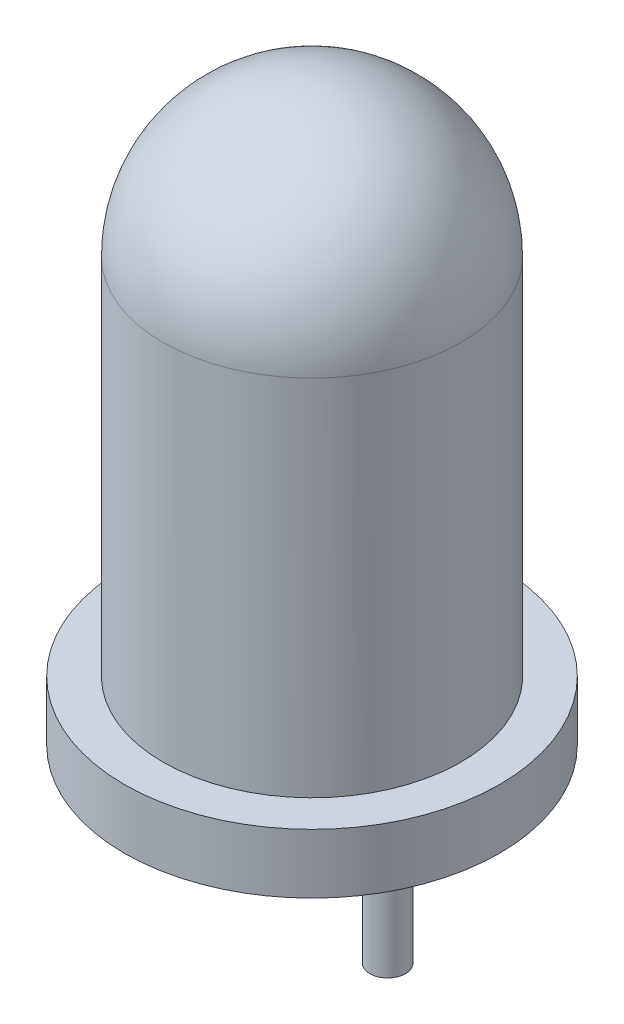
ISO-10303-21;
HEADER;
FILE_DESCRIPTION(('STEP AP214'),'2;1');
FILE_NAME('part.step','',(''),(''),'','','');
FILE_SCHEMA(('AUTOMOTIVE_DESIGN { 1 0 10303 214 1 1 1 1 }'));
ENDSEC;
DATA;
#1=APPLICATION_CONTEXT('core data for automotive mechanical design processes');
#2=APPLICATION_PROTOCOL_DEFINITION('international standard','automotive_design',2000,#1);
#3=PRODUCT_CONTEXT('',#1,'mechanical');
#4=PRODUCT('Part','Part','',(#3));
#5=PRODUCT_RELATED_PRODUCT_CATEGORY('part','',(#4));
#6=PRODUCT_DEFINITION_FORMATION('','',#4);
#7=PRODUCT_DEFINITION_CONTEXT('part definition',#1,'design');
#8=PRODUCT_DEFINITION('design','',#6,#7);
#9=PRODUCT_DEFINITION_SHAPE('','',#8);
#10=(LENGTH_UNIT() NAMED_UNIT(*) SI_UNIT(.MILLI.,.METRE.));
#11=(NAMED_UNIT(*) PLANE_ANGLE_UNIT() SI_UNIT($,.RADIAN.));
#12=(NAMED_UNIT(*) SI_UNIT($,.STERADIAN.) SOLID_ANGLE_UNIT());
#13=UNCERTAINTY_MEASURE_WITH_UNIT(LENGTH_MEASURE(1.E-05),#10,'distance_accuracy_value','');
#14=(GEOMETRIC_REPRESENTATION_CONTEXT(3) GLOBAL_UNCERTAINTY_ASSIGNED_CONTEXT((#13)) GLOBAL_UNIT_ASSIGNED_CONTEXT((#10,
#11,#12)) REPRESENTATION_CONTEXT('',''));
#15=CARTESIAN_POINT('',(0.,0.,0.));
#16=DIRECTION('',(0.,0.,1.));
#17=DIRECTION('',(1.,0.,0.));
#18=AXIS2_PLACEMENT_3D('',#15,#16,#17);
#19=CARTESIAN_POINT('',(0.,7.1,0.));
#20=DIRECTION('',(0.,1.,0.));
#21=DIRECTION('',(1.,0.,0.));
#22=AXIS2_PLACEMENT_3D('',#19,#20,#21);
#23=SPHERICAL_SURFACE('',#22,2.5);
#24=CARTESIAN_POINT('',(0.,7.1,0.));
#25=DIRECTION('',(0.,1.,0.));
#26=DIRECTION('',(0.,0.,1.));
#27=AXIS2_PLACEMENT_3D('',#24,#25,#26);
#28=CIRCLE('',#27,2.5);
#29=CARTESIAN_POINT('',(0.,7.1,2.5));
#30=VERTEX_POINT('',#29);
#31=EDGE_CURVE('E66',#30,#30,#28,.T.);
#32=ORIENTED_EDGE('',*,*,#31,.T.);
#33=EDGE_LOOP('',(#32));
#34=FACE_BOUND('',#33,.T.);
#35=ADVANCED_FACE('F44',(#34),#23,.T.);
#36=CARTESIAN_POINT('',(3.14887031052048,0.,0.));
#37=DIRECTION('',(0.,1.,0.));
#38=DIRECTION('',(0.,0.,1.));
#39=AXIS2_PLACEMENT_3D('',#36,#37,#38);
#40=PLANE('',#39);
#41=CARTESIAN_POINT('',(1.27,0.,0.));
#42=DIRECTION('',(0.,1.,0.));
#43=DIRECTION('',(0.,0.,1.));
#44=AXIS2_PLACEMENT_3D('',#41,#42,#43);
#45=CIRCLE('',#44,0.3);
#46=CARTESIAN_POINT('',(1.27,0.,0.3));
#47=VERTEX_POINT('',#46);
#48=EDGE_CURVE('E12',#47,#47,#45,.F.);
#49=ORIENTED_EDGE('',*,*,#48,.F.);
#50=EDGE_LOOP('',(#49));
#51=FACE_BOUND('',#50,.T.);
#52=CARTESIAN_POINT('',(-1.27,0.,0.));
#53=DIRECTION('',(0.,1.,0.));
#54=DIRECTION('',(0.,0.,1.));
#55=AXIS2_PLACEMENT_3D('',#52,#53,#54);
#56=CIRCLE('',#55,0.3);
#57=CARTESIAN_POINT('',(-1.27,0.,0.3));
#58=VERTEX_POINT('',#57);
#59=EDGE_CURVE('E50',#58,#58,#56,.F.);
#60=ORIENTED_EDGE('',*,*,#59,.F.);
#61=EDGE_LOOP('',(#60));
#62=FACE_BOUND('',#61,.T.);
#63=CARTESIAN_POINT('',(0.,0.,0.));
#64=DIRECTION('',(0.,1.,0.));
#65=DIRECTION('',(0.,0.,1.));
#66=AXIS2_PLACEMENT_3D('',#63,#64,#65);
#67=CIRCLE('',#66,3.14887031052048);
#68=CARTESIAN_POINT('',(0.,0.,3.14887031052048));
#69=VERTEX_POINT('',#68);
#70=EDGE_CURVE('E54',#69,#69,#67,.T.);
#71=ORIENTED_EDGE('',*,*,#70,.F.);
#72=EDGE_LOOP('',(#71));
#73=FACE_BOUND('',#72,.T.);
#74=ADVANCED_FACE('F91',(#51,#62,#73),#40,.F.);
#75=CARTESIAN_POINT('',(0.,7.1,0.));
#76=DIRECTION('',(0.,1.,0.));
#77=DIRECTION('',(0.,0.,1.));
#78=AXIS2_PLACEMENT_3D('',#75,#76,#77);
#79=CYLINDRICAL_SURFACE('',#78,3.14887031052048);
#80=CARTESIAN_POINT('',(0.,1.,0.));
#81=DIRECTION('',(0.,1.,0.));
#82=DIRECTION('',(0.,0.,1.));
#83=AXIS2_PLACEMENT_3D('',#80,#81,#82);
#84=CIRCLE('',#83,3.14887031052048);
#85=CARTESIAN_POINT('',(0.,1.,3.14887031052048));
#86=VERTEX_POINT('',#85);
#87=EDGE_CURVE('E58',#86,#86,#84,.T.);
#88=ORIENTED_EDGE('',*,*,#87,.F.);
#89=EDGE_LOOP('',(#88));
#90=FACE_BOUND('',#89,.T.);
#91=ORIENTED_EDGE('',*,*,#70,.T.);
#92=EDGE_LOOP('',(#91));
#93=FACE_BOUND('',#92,.T.);
#94=ADVANCED_FACE('F96',(#90,#93),#79,.T.);
#95=CARTESIAN_POINT('',(2.5,1.,0.));
#96=DIRECTION('',(0.,-1.,0.));
#97=DIRECTION('',(0.,0.,-1.));
#98=AXIS2_PLACEMENT_3D('',#95,#96,#97);
#99=PLANE('',#98);
#100=CARTESIAN_POINT('',(0.,1.,0.));
#101=DIRECTION('',(0.,1.,0.));
#102=DIRECTION('',(0.,0.,1.));
#103=AXIS2_PLACEMENT_3D('',#100,#101,#102);
#104=CIRCLE('',#103,2.5);
#105=CARTESIAN_POINT('',(0.,1.,2.5));
#106=VERTEX_POINT('',#105);
#107=EDGE_CURVE('E63',#106,#106,#104,.T.);
#108=ORIENTED_EDGE('',*,*,#107,.F.);
#109=EDGE_LOOP('',(#108));
#110=FACE_BOUND('',#109,.T.);
#111=ORIENTED_EDGE('',*,*,#87,.T.);
#112=EDGE_LOOP('',(#111));
#113=FACE_BOUND('',#112,.T.);
#114=ADVANCED_FACE('F103',(#110,#113),#99,.F.);
#115=CARTESIAN_POINT('',(0.,7.1,0.));
#116=DIRECTION('',(0.,1.,0.));
#117=DIRECTION('',(0.,0.,1.));
#118=AXIS2_PLACEMENT_3D('',#115,#116,#117);
#119=CYLINDRICAL_SURFACE('',#118,2.5);
#120=ORIENTED_EDGE('',*,*,#31,.F.);
#121=EDGE_LOOP('',(#120));
#122=FACE_BOUND('',#121,.T.);
#123=ORIENTED_EDGE('',*,*,#107,.T.);
#124=EDGE_LOOP('',(#123));
#125=FACE_BOUND('',#124,.T.);
#126=ADVANCED_FACE('F100',(#122,#125),#119,.T.);
#127=CARTESIAN_POINT('',(-1.27,-2.54,0.));
#128=DIRECTION('',(0.,1.,0.));
#129=DIRECTION('',(0.,0.,1.));
#130=AXIS2_PLACEMENT_3D('',#127,#128,#129);
#131=CYLINDRICAL_SURFACE('',#130,0.3);
#132=CARTESIAN_POINT('',(-1.27,-2.54,0.));
#133=DIRECTION('',(0.,-1.,0.));
#134=DIRECTION('',(0.,0.,-1.));
#135=AXIS2_PLACEMENT_3D('',#132,#133,#134);
#136=CIRCLE('',#135,0.3);
#137=CARTESIAN_POINT('',(-1.27,-2.54,-0.3));
#138=VERTEX_POINT('',#137);
#139=EDGE_CURVE('E69',#138,#138,#136,.T.);
#140=ORIENTED_EDGE('',*,*,#139,.F.);
#141=EDGE_LOOP('',(#140));
#142=FACE_BOUND('',#141,.T.);
#143=ORIENTED_EDGE('',*,*,#59,.T.);
#144=EDGE_LOOP('',(#143));
#145=FACE_BOUND('',#144,.T.);
#146=ADVANCED_FACE('F87',(#142,#145),#131,.T.);
#147=CARTESIAN_POINT('',(-1.27,-2.54,0.));
#148=DIRECTION('',(0.,-1.,0.));
#149=DIRECTION('',(0.,0.,-1.));
#150=AXIS2_PLACEMENT_3D('',#147,#148,#149);
#151=PLANE('',#150);
#152=ORIENTED_EDGE('',*,*,#139,.T.);
#153=EDGE_LOOP('',(#152));
#154=FACE_BOUND('',#153,.T.);
#155=ADVANCED_FACE('F80',(#154),#151,.T.);
#156=CARTESIAN_POINT('',(1.27,-2.54,0.));
#157=DIRECTION('',(0.,1.,0.));
#158=DIRECTION('',(0.,0.,1.));
#159=AXIS2_PLACEMENT_3D('',#156,#157,#158);
#160=CYLINDRICAL_SURFACE('',#159,0.3);
#161=CARTESIAN_POINT('',(1.27,-2.54,0.));
#162=DIRECTION('',(0.,-1.,0.));
#163=DIRECTION('',(0.,0.,1.));
#164=AXIS2_PLACEMENT_3D('',#161,#162,#163);
#165=CIRCLE('',#164,0.3);
#166=CARTESIAN_POINT('',(1.27,-2.54,0.3));
#167=VERTEX_POINT('',#166);
#168=EDGE_CURVE('E72',#167,#167,#165,.T.);
#169=ORIENTED_EDGE('',*,*,#168,.F.);
#170=EDGE_LOOP('',(#169));
#171=FACE_BOUND('',#170,.T.);
#172=ORIENTED_EDGE('',*,*,#48,.T.);
#173=EDGE_LOOP('',(#172));
#174=FACE_BOUND('',#173,.T.);
#175=ADVANCED_FACE('F78',(#171,#174),#160,.T.);
#176=CARTESIAN_POINT('',(1.27,-2.54,0.));
#177=DIRECTION('',(0.,1.,0.));
#178=DIRECTION('',(0.,0.,1.));
#179=AXIS2_PLACEMENT_3D('',#176,#177,#178);
#180=PLANE('',#179);
#181=ORIENTED_EDGE('',*,*,#168,.T.);
#182=EDGE_LOOP('',(#181));
#183=FACE_BOUND('',#182,.T.);
#184=ADVANCED_FACE('F76',(#183),#180,.F.);
#185=CLOSED_SHELL('',(#35,#74,#94,#114,#126,#146,#155,#175,#184));
#186=MANIFOLD_SOLID_BREP('B2',#185);
#187=ADVANCED_BREP_SHAPE_REPRESENTATION('',(#18,#186),#14);
#188=SHAPE_DEFINITION_REPRESENTATION(#9,#187);
ENDSEC;
END-ISO-10303-21;
